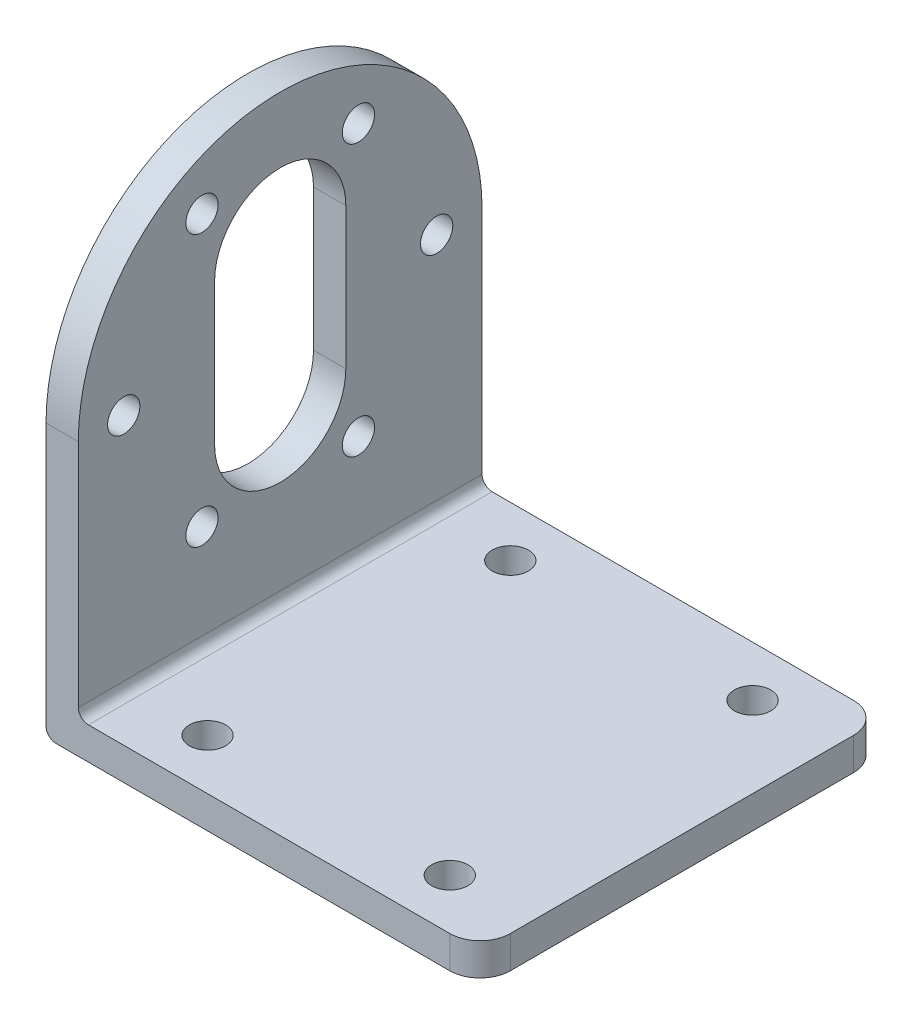
ISO-10303-21;
HEADER;
FILE_DESCRIPTION(('STEP AP214'),'2;1');
FILE_NAME('part.step','',(''),(''),'','','');
FILE_SCHEMA(('AUTOMOTIVE_DESIGN { 1 0 10303 214 1 1 1 1 }'));
ENDSEC;
DATA;
#1=APPLICATION_CONTEXT('core data for automotive mechanical design processes');
#2=APPLICATION_PROTOCOL_DEFINITION('international standard','automotive_design',2000,#1);
#3=PRODUCT_CONTEXT('',#1,'mechanical');
#4=PRODUCT('Part','Part','',(#3));
#5=PRODUCT_RELATED_PRODUCT_CATEGORY('part','',(#4));
#6=PRODUCT_DEFINITION_FORMATION('','',#4);
#7=PRODUCT_DEFINITION_CONTEXT('part definition',#1,'design');
#8=PRODUCT_DEFINITION('design','',#6,#7);
#9=PRODUCT_DEFINITION_SHAPE('','',#8);
#10=(LENGTH_UNIT() NAMED_UNIT(*) SI_UNIT(.MILLI.,.METRE.));
#11=(NAMED_UNIT(*) PLANE_ANGLE_UNIT() SI_UNIT($,.RADIAN.));
#12=(NAMED_UNIT(*) SI_UNIT($,.STERADIAN.) SOLID_ANGLE_UNIT());
#13=UNCERTAINTY_MEASURE_WITH_UNIT(LENGTH_MEASURE(1.E-05),#10,'distance_accuracy_value','');
#14=(GEOMETRIC_REPRESENTATION_CONTEXT(3) GLOBAL_UNCERTAINTY_ASSIGNED_CONTEXT((#13)) GLOBAL_UNIT_ASSIGNED_CONTEXT((#10,
#11,#12)) REPRESENTATION_CONTEXT('',''));
#15=CARTESIAN_POINT('',(0.,0.,0.));
#16=DIRECTION('',(0.,0.,1.));
#17=DIRECTION('',(1.,0.,0.));
#18=AXIS2_PLACEMENT_3D('',#15,#16,#17);
#19=CARTESIAN_POINT('',(0.,3.2,0.));
#20=DIRECTION('',(0.,-1.,0.));
#21=DIRECTION('',(0.,0.,-1.));
#22=AXIS2_PLACEMENT_3D('',#19,#20,#21);
#23=PLANE('',#22);
#24=CARTESIAN_POINT('',(-10.5,3.2,-15.));
#25=DIRECTION('',(0.,1.,0.));
#26=DIRECTION('',(0.,0.,1.));
#27=AXIS2_PLACEMENT_3D('',#24,#25,#26);
#28=CIRCLE('',#27,1.8);
#29=CARTESIAN_POINT('',(-10.5,3.2,-13.2));
#30=VERTEX_POINT('',#29);
#31=EDGE_CURVE('E186',#30,#30,#28,.T.);
#32=ORIENTED_EDGE('',*,*,#31,.F.);
#33=EDGE_LOOP('',(#32));
#34=FACE_BOUND('',#33,.T.);
#35=CARTESIAN_POINT('',(-10.5,3.2,15.));
#36=DIRECTION('',(0.,1.,0.));
#37=DIRECTION('',(0.,0.,1.));
#38=AXIS2_PLACEMENT_3D('',#35,#36,#37);
#39=CIRCLE('',#38,1.8);
#40=CARTESIAN_POINT('',(-10.5,3.2,16.8));
#41=VERTEX_POINT('',#40);
#42=EDGE_CURVE('E192',#41,#41,#39,.T.);
#43=ORIENTED_EDGE('',*,*,#42,.F.);
#44=EDGE_LOOP('',(#43));
#45=FACE_BOUND('',#44,.T.);
#46=CARTESIAN_POINT('',(13.5,3.2,15.));
#47=DIRECTION('',(0.,1.,0.));
#48=DIRECTION('',(0.,0.,1.));
#49=AXIS2_PLACEMENT_3D('',#46,#47,#48);
#50=CIRCLE('',#49,1.8);
#51=CARTESIAN_POINT('',(13.5,3.2,16.8));
#52=VERTEX_POINT('',#51);
#53=EDGE_CURVE('E158',#52,#52,#50,.T.);
#54=ORIENTED_EDGE('',*,*,#53,.F.);
#55=EDGE_LOOP('',(#54));
#56=FACE_BOUND('',#55,.T.);
#57=CARTESIAN_POINT('',(13.5,3.2,-15.));
#58=DIRECTION('',(0.,1.,0.));
#59=DIRECTION('',(0.,0.,1.));
#60=AXIS2_PLACEMENT_3D('',#57,#58,#59);
#61=CIRCLE('',#60,1.8);
#62=CARTESIAN_POINT('',(13.5,3.2,-13.2));
#63=VERTEX_POINT('',#62);
#64=EDGE_CURVE('E185',#63,#63,#61,.T.);
#65=ORIENTED_EDGE('',*,*,#64,.F.);
#66=EDGE_LOOP('',(#65));
#67=FACE_BOUND('',#66,.T.);
#68=DIRECTION('',(-1.,0.,0.));
#69=VECTOR('',#68,1.);
#70=CARTESIAN_POINT('',(-21.5,3.2,-20.));
#71=LINE('',#70,#69);
#72=CARTESIAN_POINT('',(18.5,3.2,-20.));
#73=VERTEX_POINT('',#72);
#74=CARTESIAN_POINT('',(-17.3,3.2,-20.));
#75=VERTEX_POINT('',#74);
#76=EDGE_CURVE('E227',#73,#75,#71,.T.);
#77=ORIENTED_EDGE('',*,*,#76,.T.);
#78=DIRECTION('',(0.,0.,-1.));
#79=VECTOR('',#78,1.);
#80=CARTESIAN_POINT('',(-17.3,3.2,20.));
#81=LINE('',#80,#79);
#82=CARTESIAN_POINT('',(-17.3,3.2,20.));
#83=VERTEX_POINT('',#82);
#84=EDGE_CURVE('E266',#75,#83,#81,.F.);
#85=ORIENTED_EDGE('',*,*,#84,.T.);
#86=DIRECTION('',(1.,0.,0.));
#87=VECTOR('',#86,1.);
#88=CARTESIAN_POINT('',(-21.5,3.2,20.));
#89=LINE('',#88,#87);
#90=CARTESIAN_POINT('',(18.5,3.2,20.));
#91=VERTEX_POINT('',#90);
#92=EDGE_CURVE('E231',#83,#91,#89,.T.);
#93=ORIENTED_EDGE('',*,*,#92,.T.);
#94=CARTESIAN_POINT('',(18.5,3.2,17.));
#95=DIRECTION('',(0.,-1.,0.));
#96=DIRECTION('',(0.,0.,-1.));
#97=AXIS2_PLACEMENT_3D('',#94,#95,#96);
#98=CIRCLE('',#97,3.);
#99=CARTESIAN_POINT('',(21.5,3.2,17.));
#100=VERTEX_POINT('',#99);
#101=EDGE_CURVE('E258',#91,#100,#98,.F.);
#102=ORIENTED_EDGE('',*,*,#101,.T.);
#103=DIRECTION('',(0.,0.,-1.));
#104=VECTOR('',#103,1.);
#105=CARTESIAN_POINT('',(21.5,3.2,20.));
#106=LINE('',#105,#104);
#107=CARTESIAN_POINT('',(21.5,3.2,-17.));
#108=VERTEX_POINT('',#107);
#109=EDGE_CURVE('E224',#100,#108,#106,.T.);
#110=ORIENTED_EDGE('',*,*,#109,.T.);
#111=CARTESIAN_POINT('',(18.5,3.2,-17.));
#112=DIRECTION('',(0.,-1.,0.));
#113=DIRECTION('',(0.,0.,-1.));
#114=AXIS2_PLACEMENT_3D('',#111,#112,#113);
#115=CIRCLE('',#114,3.);
#116=EDGE_CURVE('E256',#108,#73,#115,.F.);
#117=ORIENTED_EDGE('',*,*,#116,.T.);
#118=EDGE_LOOP('',(#77,#85,#93,#102,#110,#117));
#119=FACE_BOUND('',#118,.T.);
#120=ADVANCED_FACE('F37',(#34,#45,#56,#67,#119),#23,.F.);
#121=CARTESIAN_POINT('',(21.5,3.2,20.));
#122=DIRECTION('',(-1.,0.,0.));
#123=DIRECTION('',(0.,0.,1.));
#124=AXIS2_PLACEMENT_3D('',#121,#122,#123);
#125=PLANE('',#124);
#126=ORIENTED_EDGE('',*,*,#109,.F.);
#127=DIRECTION('',(0.,-1.,0.));
#128=VECTOR('',#127,1.);
#129=CARTESIAN_POINT('',(21.5,3.2,17.));
#130=LINE('',#129,#128);
#131=CARTESIAN_POINT('',(21.5,0.,17.));
#132=VERTEX_POINT('',#131);
#133=EDGE_CURVE('E245',#100,#132,#130,.T.);
#134=ORIENTED_EDGE('',*,*,#133,.T.);
#135=DIRECTION('',(0.,0.,-1.));
#136=VECTOR('',#135,1.);
#137=CARTESIAN_POINT('',(21.5,0.,20.));
#138=LINE('',#137,#136);
#139=CARTESIAN_POINT('',(21.5,0.,-17.));
#140=VERTEX_POINT('',#139);
#141=EDGE_CURVE('E223',#132,#140,#138,.T.);
#142=ORIENTED_EDGE('',*,*,#141,.T.);
#143=DIRECTION('',(0.,-1.,0.));
#144=VECTOR('',#143,1.);
#145=CARTESIAN_POINT('',(21.5,3.2,-17.));
#146=LINE('',#145,#144);
#147=EDGE_CURVE('E243',#140,#108,#146,.F.);
#148=ORIENTED_EDGE('',*,*,#147,.T.);
#149=EDGE_LOOP('',(#126,#134,#142,#148));
#150=FACE_BOUND('',#149,.T.);
#151=ADVANCED_FACE('F304',(#150),#125,.F.);
#152=CARTESIAN_POINT('',(-21.5,3.2,-20.));
#153=DIRECTION('',(0.,0.,1.));
#154=DIRECTION('',(1.,0.,0.));
#155=AXIS2_PLACEMENT_3D('',#152,#153,#154);
#156=PLANE('',#155);
#157=DIRECTION('',(-1.,0.,0.));
#158=VECTOR('',#157,1.);
#159=CARTESIAN_POINT('',(-21.5,0.,-20.));
#160=LINE('',#159,#158);
#161=CARTESIAN_POINT('',(18.5,0.,-20.));
#162=VERTEX_POINT('',#161);
#163=CARTESIAN_POINT('',(-20.5,0.,-20.));
#164=VERTEX_POINT('',#163);
#165=EDGE_CURVE('E236',#162,#164,#160,.T.);
#166=ORIENTED_EDGE('',*,*,#165,.T.);
#167=CARTESIAN_POINT('',(-20.5,1.,-20.));
#168=DIRECTION('',(0.,0.,1.));
#169=DIRECTION('',(1.,0.,0.));
#170=AXIS2_PLACEMENT_3D('',#167,#168,#169);
#171=CIRCLE('',#170,1.);
#172=CARTESIAN_POINT('',(-21.5,1.,-20.));
#173=VERTEX_POINT('',#172);
#174=EDGE_CURVE('E273',#164,#173,#171,.F.);
#175=ORIENTED_EDGE('',*,*,#174,.T.);
#176=DIRECTION('',(0.,-1.,0.));
#177=VECTOR('',#176,1.);
#178=CARTESIAN_POINT('',(-21.5,3.2,-20.));
#179=LINE('',#178,#177);
#180=CARTESIAN_POINT('',(-21.5,27.,-20.));
#181=VERTEX_POINT('',#180);
#182=EDGE_CURVE('E240',#181,#173,#179,.T.);
#183=ORIENTED_EDGE('',*,*,#182,.F.);
#184=DIRECTION('',(-1.,0.,0.));
#185=VECTOR('',#184,1.);
#186=CARTESIAN_POINT('',(-21.5,27.,-20.));
#187=LINE('',#186,#185);
#188=CARTESIAN_POINT('',(-18.3,27.,-20.));
#189=VERTEX_POINT('',#188);
#190=EDGE_CURVE('E214',#189,#181,#187,.T.);
#191=ORIENTED_EDGE('',*,*,#190,.F.);
#192=DIRECTION('',(0.,-1.,0.));
#193=VECTOR('',#192,1.);
#194=CARTESIAN_POINT('',(-18.3,27.,-20.));
#195=LINE('',#194,#193);
#196=CARTESIAN_POINT('',(-18.3,4.2,-20.));
#197=VERTEX_POINT('',#196);
#198=EDGE_CURVE('E217',#189,#197,#195,.T.);
#199=ORIENTED_EDGE('',*,*,#198,.T.);
#200=CARTESIAN_POINT('',(-17.3,4.2,-20.));
#201=DIRECTION('',(0.,0.,1.));
#202=DIRECTION('',(1.,0.,0.));
#203=AXIS2_PLACEMENT_3D('',#200,#201,#202);
#204=CIRCLE('',#203,1.);
#205=EDGE_CURVE('E45',#197,#75,#204,.T.);
#206=ORIENTED_EDGE('',*,*,#205,.T.);
#207=ORIENTED_EDGE('',*,*,#76,.F.);
#208=DIRECTION('',(0.,-1.,0.));
#209=VECTOR('',#208,1.);
#210=CARTESIAN_POINT('',(18.5,3.2,-20.));
#211=LINE('',#210,#209);
#212=EDGE_CURVE('E260',#73,#162,#211,.T.);
#213=ORIENTED_EDGE('',*,*,#212,.T.);
#214=EDGE_LOOP('',(#166,#175,#183,#191,#199,#206,#207,#213));
#215=FACE_BOUND('',#214,.T.);
#216=ADVANCED_FACE('F276',(#215),#156,.F.);
#217=CARTESIAN_POINT('',(-21.5,3.2,20.));
#218=DIRECTION('',(1.,0.,0.));
#219=DIRECTION('',(0.,0.,-1.));
#220=AXIS2_PLACEMENT_3D('',#217,#218,#219);
#221=PLANE('',#220);
#222=CARTESIAN_POINT('',(-21.5,26.9999999999997,15.4999999999997));
#223=DIRECTION('',(1.,0.,0.));
#224=DIRECTION('',(0.,0.,-1.));
#225=AXIS2_PLACEMENT_3D('',#222,#223,#224);
#226=CIRCLE('',#225,1.6);
#227=CARTESIAN_POINT('',(-21.5,26.9999999999997,13.8999999999997));
#228=VERTEX_POINT('',#227);
#229=EDGE_CURVE('E566',#228,#228,#226,.F.);
#230=ORIENTED_EDGE('',*,*,#229,.F.);
#231=EDGE_LOOP('',(#230));
#232=FACE_BOUND('',#231,.T.);
#233=CARTESIAN_POINT('',(-21.5,13.5766062413411,7.74999999999928));
#234=DIRECTION('',(1.,0.,0.));
#235=DIRECTION('',(0.,0.,-1.));
#236=AXIS2_PLACEMENT_3D('',#233,#234,#235);
#237=CIRCLE('',#236,1.6);
#238=CARTESIAN_POINT('',(-21.5,13.5766062413411,6.14999999999927));
#239=VERTEX_POINT('',#238);
#240=EDGE_CURVE('E570',#239,#239,#237,.F.);
#241=ORIENTED_EDGE('',*,*,#240,.F.);
#242=EDGE_LOOP('',(#241));
#243=FACE_BOUND('',#242,.T.);
#244=CARTESIAN_POINT('',(-21.5,13.5766062413416,-7.75000000000076));
#245=DIRECTION('',(1.,0.,0.));
#246=DIRECTION('',(0.,0.,-1.));
#247=AXIS2_PLACEMENT_3D('',#244,#245,#246);
#248=CIRCLE('',#247,1.6);
#249=CARTESIAN_POINT('',(-21.5,13.5766062413416,-9.35000000000076));
#250=VERTEX_POINT('',#249);
#251=EDGE_CURVE('E591',#250,#250,#248,.F.);
#252=ORIENTED_EDGE('',*,*,#251,.F.);
#253=EDGE_LOOP('',(#252));
#254=FACE_BOUND('',#253,.T.);
#255=CARTESIAN_POINT('',(-21.5,27.0000000000006,-15.5000000000004));
#256=DIRECTION('',(1.,0.,0.));
#257=DIRECTION('',(0.,0.,-1.));
#258=AXIS2_PLACEMENT_3D('',#255,#256,#257);
#259=CIRCLE('',#258,1.6);
#260=CARTESIAN_POINT('',(-21.5,27.0000000000006,-17.1000000000004));
#261=VERTEX_POINT('',#260);
#262=EDGE_CURVE('E585',#261,#261,#259,.F.);
#263=ORIENTED_EDGE('',*,*,#262,.F.);
#264=EDGE_LOOP('',(#263));
#265=FACE_BOUND('',#264,.T.);
#266=CARTESIAN_POINT('',(-21.5,40.4233937586592,-7.75000000000001));
#267=DIRECTION('',(1.,0.,0.));
#268=DIRECTION('',(0.,0.,-1.));
#269=AXIS2_PLACEMENT_3D('',#266,#267,#268);
#270=CIRCLE('',#269,1.60000000000001);
#271=CARTESIAN_POINT('',(-21.5,40.4233937586592,-9.35000000000001));
#272=VERTEX_POINT('',#271);
#273=EDGE_CURVE('E579',#272,#272,#270,.F.);
#274=ORIENTED_EDGE('',*,*,#273,.F.);
#275=EDGE_LOOP('',(#274));
#276=FACE_BOUND('',#275,.T.);
#277=CARTESIAN_POINT('',(-21.5,40.4233937586588,7.75000000000002));
#278=DIRECTION('',(1.,0.,0.));
#279=DIRECTION('',(0.,0.,-1.));
#280=AXIS2_PLACEMENT_3D('',#277,#278,#279);
#281=CIRCLE('',#280,1.6);
#282=CARTESIAN_POINT('',(-21.5,40.4233937586588,6.15000000000003));
#283=VERTEX_POINT('',#282);
#284=EDGE_CURVE('E578',#283,#283,#281,.F.);
#285=ORIENTED_EDGE('',*,*,#284,.F.);
#286=EDGE_LOOP('',(#285));
#287=FACE_BOUND('',#286,.T.);
#288=DIRECTION('',(0.,-1.,0.));
#289=VECTOR('',#288,1.);
#290=CARTESIAN_POINT('',(-21.5,34.,-6.5));
#291=LINE('',#290,#289);
#292=CARTESIAN_POINT('',(-21.5,34.,-6.5));
#293=VERTEX_POINT('',#292);
#294=CARTESIAN_POINT('',(-21.5,20.,-6.5));
#295=VERTEX_POINT('',#294);
#296=EDGE_CURVE('E164',#293,#295,#291,.T.);
#297=ORIENTED_EDGE('',*,*,#296,.F.);
#298=CARTESIAN_POINT('',(-21.5,34.,0.));
#299=DIRECTION('',(1.,0.,0.));
#300=DIRECTION('',(0.,0.,-1.));
#301=AXIS2_PLACEMENT_3D('',#298,#299,#300);
#302=CIRCLE('',#301,6.5);
#303=CARTESIAN_POINT('',(-21.5,34.,6.5));
#304=VERTEX_POINT('',#303);
#305=EDGE_CURVE('E142',#304,#293,#302,.F.);
#306=ORIENTED_EDGE('',*,*,#305,.F.);
#307=DIRECTION('',(0.,1.,0.));
#308=VECTOR('',#307,1.);
#309=CARTESIAN_POINT('',(-21.5,34.,6.5));
#310=LINE('',#309,#308);
#311=CARTESIAN_POINT('',(-21.5,20.,6.5));
#312=VERTEX_POINT('',#311);
#313=EDGE_CURVE('E154',#312,#304,#310,.T.);
#314=ORIENTED_EDGE('',*,*,#313,.F.);
#315=CARTESIAN_POINT('',(-21.5,20.,0.));
#316=DIRECTION('',(1.,0.,0.));
#317=DIRECTION('',(0.,0.,-1.));
#318=AXIS2_PLACEMENT_3D('',#315,#316,#317);
#319=CIRCLE('',#318,6.5);
#320=EDGE_CURVE('E168',#295,#312,#319,.F.);
#321=ORIENTED_EDGE('',*,*,#320,.F.);
#322=EDGE_LOOP('',(#297,#306,#314,#321));
#323=FACE_BOUND('',#322,.T.);
#324=ORIENTED_EDGE('',*,*,#182,.T.);
#325=DIRECTION('',(0.,0.,1.));
#326=VECTOR('',#325,1.);
#327=CARTESIAN_POINT('',(-21.5,1.,20.));
#328=LINE('',#327,#326);
#329=CARTESIAN_POINT('',(-21.5,1.,20.));
#330=VERTEX_POINT('',#329);
#331=EDGE_CURVE('E268',#173,#330,#328,.T.);
#332=ORIENTED_EDGE('',*,*,#331,.T.);
#333=DIRECTION('',(0.,-1.,0.));
#334=VECTOR('',#333,1.);
#335=CARTESIAN_POINT('',(-21.5,3.2,20.));
#336=LINE('',#335,#334);
#337=CARTESIAN_POINT('',(-21.5,27.,20.));
#338=VERTEX_POINT('',#337);
#339=EDGE_CURVE('E233',#338,#330,#336,.T.);
#340=ORIENTED_EDGE('',*,*,#339,.F.);
#341=CARTESIAN_POINT('',(-21.5,27.,0.));
#342=DIRECTION('',(1.,0.,0.));
#343=DIRECTION('',(0.,0.,-1.));
#344=AXIS2_PLACEMENT_3D('',#341,#342,#343);
#345=CIRCLE('',#344,20.);
#346=EDGE_CURVE('E206',#338,#181,#345,.F.);
#347=ORIENTED_EDGE('',*,*,#346,.T.);
#348=EDGE_LOOP('',(#324,#332,#340,#347));
#349=FACE_BOUND('',#348,.T.);
#350=ADVANCED_FACE('F161',(#232,#243,#254,#265,#276,#287,#323,#349),#221,.F.);
#351=CARTESIAN_POINT('',(-21.5,3.2,20.));
#352=DIRECTION('',(0.,0.,-1.));
#353=DIRECTION('',(-1.,0.,0.));
#354=AXIS2_PLACEMENT_3D('',#351,#352,#353);
#355=PLANE('',#354);
#356=ORIENTED_EDGE('',*,*,#339,.T.);
#357=CARTESIAN_POINT('',(-20.5,1.,20.));
#358=DIRECTION('',(0.,0.,-1.));
#359=DIRECTION('',(-1.,0.,0.));
#360=AXIS2_PLACEMENT_3D('',#357,#358,#359);
#361=CIRCLE('',#360,1.);
#362=CARTESIAN_POINT('',(-20.5,0.,20.));
#363=VERTEX_POINT('',#362);
#364=EDGE_CURVE('E60',#330,#363,#361,.F.);
#365=ORIENTED_EDGE('',*,*,#364,.T.);
#366=DIRECTION('',(1.,0.,0.));
#367=VECTOR('',#366,1.);
#368=CARTESIAN_POINT('',(-21.5,0.,20.));
#369=LINE('',#368,#367);
#370=CARTESIAN_POINT('',(18.5,0.,20.));
#371=VERTEX_POINT('',#370);
#372=EDGE_CURVE('E228',#363,#371,#369,.T.);
#373=ORIENTED_EDGE('',*,*,#372,.T.);
#374=DIRECTION('',(0.,-1.,0.));
#375=VECTOR('',#374,1.);
#376=CARTESIAN_POINT('',(18.5,3.2,20.));
#377=LINE('',#376,#375);
#378=EDGE_CURVE('E253',#371,#91,#377,.F.);
#379=ORIENTED_EDGE('',*,*,#378,.T.);
#380=ORIENTED_EDGE('',*,*,#92,.F.);
#381=CARTESIAN_POINT('',(-17.3,4.2,20.));
#382=DIRECTION('',(0.,0.,-1.));
#383=DIRECTION('',(-1.,0.,0.));
#384=AXIS2_PLACEMENT_3D('',#381,#382,#383);
#385=CIRCLE('',#384,1.);
#386=CARTESIAN_POINT('',(-18.3,4.2,20.));
#387=VERTEX_POINT('',#386);
#388=EDGE_CURVE('E11',#83,#387,#385,.T.);
#389=ORIENTED_EDGE('',*,*,#388,.T.);
#390=DIRECTION('',(0.,-1.,0.));
#391=VECTOR('',#390,1.);
#392=CARTESIAN_POINT('',(-18.3,27.,20.));
#393=LINE('',#392,#391);
#394=CARTESIAN_POINT('',(-18.3,27.,20.));
#395=VERTEX_POINT('',#394);
#396=EDGE_CURVE('E220',#395,#387,#393,.T.);
#397=ORIENTED_EDGE('',*,*,#396,.F.);
#398=DIRECTION('',(1.,0.,0.));
#399=VECTOR('',#398,1.);
#400=CARTESIAN_POINT('',(-21.5,27.,20.));
#401=LINE('',#400,#399);
#402=EDGE_CURVE('E209',#338,#395,#401,.T.);
#403=ORIENTED_EDGE('',*,*,#402,.F.);
#404=EDGE_LOOP('',(#356,#365,#373,#379,#380,#389,#397,#403));
#405=FACE_BOUND('',#404,.T.);
#406=ADVANCED_FACE('F287',(#405),#355,.F.);
#407=CARTESIAN_POINT('',(0.,0.,0.));
#408=DIRECTION('',(0.,-1.,0.));
#409=DIRECTION('',(0.,0.,-1.));
#410=AXIS2_PLACEMENT_3D('',#407,#408,#409);
#411=PLANE('',#410);
#412=CARTESIAN_POINT('',(-10.5,0.,-15.));
#413=DIRECTION('',(0.,1.,0.));
#414=DIRECTION('',(0.,0.,1.));
#415=AXIS2_PLACEMENT_3D('',#412,#413,#414);
#416=CIRCLE('',#415,1.8);
#417=CARTESIAN_POINT('',(-10.5,0.,-13.2));
#418=VERTEX_POINT('',#417);
#419=EDGE_CURVE('E182',#418,#418,#416,.T.);
#420=ORIENTED_EDGE('',*,*,#419,.T.);
#421=EDGE_LOOP('',(#420));
#422=FACE_BOUND('',#421,.T.);
#423=CARTESIAN_POINT('',(-10.5,0.,15.));
#424=DIRECTION('',(0.,1.,0.));
#425=DIRECTION('',(0.,0.,1.));
#426=AXIS2_PLACEMENT_3D('',#423,#424,#425);
#427=CIRCLE('',#426,1.8);
#428=CARTESIAN_POINT('',(-10.5,0.,16.8));
#429=VERTEX_POINT('',#428);
#430=EDGE_CURVE('E189',#429,#429,#427,.T.);
#431=ORIENTED_EDGE('',*,*,#430,.T.);
#432=EDGE_LOOP('',(#431));
#433=FACE_BOUND('',#432,.T.);
#434=CARTESIAN_POINT('',(13.5,0.,15.));
#435=DIRECTION('',(0.,1.,0.));
#436=DIRECTION('',(0.,0.,1.));
#437=AXIS2_PLACEMENT_3D('',#434,#435,#436);
#438=CIRCLE('',#437,1.8);
#439=CARTESIAN_POINT('',(13.5,0.,16.8));
#440=VERTEX_POINT('',#439);
#441=EDGE_CURVE('E195',#440,#440,#438,.T.);
#442=ORIENTED_EDGE('',*,*,#441,.T.);
#443=EDGE_LOOP('',(#442));
#444=FACE_BOUND('',#443,.T.);
#445=CARTESIAN_POINT('',(13.5,0.,-15.));
#446=DIRECTION('',(0.,1.,0.));
#447=DIRECTION('',(0.,0.,1.));
#448=AXIS2_PLACEMENT_3D('',#445,#446,#447);
#449=CIRCLE('',#448,1.8);
#450=CARTESIAN_POINT('',(13.5,0.,-13.2));
#451=VERTEX_POINT('',#450);
#452=EDGE_CURVE('E200',#451,#451,#449,.T.);
#453=ORIENTED_EDGE('',*,*,#452,.T.);
#454=EDGE_LOOP('',(#453));
#455=FACE_BOUND('',#454,.T.);
#456=ORIENTED_EDGE('',*,*,#372,.F.);
#457=DIRECTION('',(0.,0.,1.));
#458=VECTOR('',#457,1.);
#459=CARTESIAN_POINT('',(-20.5,0.,-20.));
#460=LINE('',#459,#458);
#461=EDGE_CURVE('E52',#363,#164,#460,.F.);
#462=ORIENTED_EDGE('',*,*,#461,.T.);
#463=ORIENTED_EDGE('',*,*,#165,.F.);
#464=CARTESIAN_POINT('',(18.5,0.,-17.));
#465=DIRECTION('',(0.,-1.,0.));
#466=DIRECTION('',(0.,0.,-1.));
#467=AXIS2_PLACEMENT_3D('',#464,#465,#466);
#468=CIRCLE('',#467,3.);
#469=EDGE_CURVE('E248',#162,#140,#468,.T.);
#470=ORIENTED_EDGE('',*,*,#469,.T.);
#471=ORIENTED_EDGE('',*,*,#141,.F.);
#472=CARTESIAN_POINT('',(18.5,0.,17.));
#473=DIRECTION('',(0.,-1.,0.));
#474=DIRECTION('',(0.,0.,-1.));
#475=AXIS2_PLACEMENT_3D('',#472,#473,#474);
#476=CIRCLE('',#475,3.);
#477=EDGE_CURVE('E250',#132,#371,#476,.T.);
#478=ORIENTED_EDGE('',*,*,#477,.T.);
#479=EDGE_LOOP('',(#456,#462,#463,#470,#471,#478));
#480=FACE_BOUND('',#479,.T.);
#481=ADVANCED_FACE('F298',(#422,#433,#444,#455,#480),#411,.T.);
#482=CARTESIAN_POINT('',(-18.3,27.,20.));
#483=DIRECTION('',(-1.,0.,0.));
#484=DIRECTION('',(0.,0.,1.));
#485=AXIS2_PLACEMENT_3D('',#482,#483,#484);
#486=PLANE('',#485);
#487=CARTESIAN_POINT('',(-18.3,26.9999999999997,15.4999999999997));
#488=DIRECTION('',(1.,0.,0.));
#489=DIRECTION('',(0.,0.,-1.));
#490=AXIS2_PLACEMENT_3D('',#487,#488,#489);
#491=CIRCLE('',#490,1.6);
#492=CARTESIAN_POINT('',(-18.3,26.9999999999997,13.8999999999997));
#493=VERTEX_POINT('',#492);
#494=EDGE_CURVE('E563',#493,#493,#491,.T.);
#495=ORIENTED_EDGE('',*,*,#494,.F.);
#496=EDGE_LOOP('',(#495));
#497=FACE_BOUND('',#496,.T.);
#498=CARTESIAN_POINT('',(-18.3,13.5766062413411,7.74999999999928));
#499=DIRECTION('',(1.,0.,0.));
#500=DIRECTION('',(0.,0.,-1.));
#501=AXIS2_PLACEMENT_3D('',#498,#499,#500);
#502=CIRCLE('',#501,1.6);
#503=CARTESIAN_POINT('',(-18.3,13.5766062413411,6.14999999999927));
#504=VERTEX_POINT('',#503);
#505=EDGE_CURVE('E567',#504,#504,#502,.T.);
#506=ORIENTED_EDGE('',*,*,#505,.F.);
#507=EDGE_LOOP('',(#506));
#508=FACE_BOUND('',#507,.T.);
#509=CARTESIAN_POINT('',(-18.3,13.5766062413416,-7.75000000000076));
#510=DIRECTION('',(1.,0.,0.));
#511=DIRECTION('',(0.,0.,-1.));
#512=AXIS2_PLACEMENT_3D('',#509,#510,#511);
#513=CIRCLE('',#512,1.6);
#514=CARTESIAN_POINT('',(-18.3,13.5766062413416,-9.35000000000076));
#515=VERTEX_POINT('',#514);
#516=EDGE_CURVE('E607',#515,#515,#513,.T.);
#517=ORIENTED_EDGE('',*,*,#516,.F.);
#518=EDGE_LOOP('',(#517));
#519=FACE_BOUND('',#518,.T.);
#520=CARTESIAN_POINT('',(-18.3,27.0000000000006,-15.5000000000004));
#521=DIRECTION('',(1.,0.,0.));
#522=DIRECTION('',(0.,0.,-1.));
#523=AXIS2_PLACEMENT_3D('',#520,#521,#522);
#524=CIRCLE('',#523,1.6);
#525=CARTESIAN_POINT('',(-18.3,27.0000000000006,-17.1000000000004));
#526=VERTEX_POINT('',#525);
#527=EDGE_CURVE('E588',#526,#526,#524,.T.);
#528=ORIENTED_EDGE('',*,*,#527,.F.);
#529=EDGE_LOOP('',(#528));
#530=FACE_BOUND('',#529,.T.);
#531=CARTESIAN_POINT('',(-18.3,40.4233937586592,-7.75000000000001));
#532=DIRECTION('',(1.,0.,0.));
#533=DIRECTION('',(0.,0.,-1.));
#534=AXIS2_PLACEMENT_3D('',#531,#532,#533);
#535=CIRCLE('',#534,1.60000000000001);
#536=CARTESIAN_POINT('',(-18.3,40.4233937586592,-9.35000000000001));
#537=VERTEX_POINT('',#536);
#538=EDGE_CURVE('E582',#537,#537,#535,.T.);
#539=ORIENTED_EDGE('',*,*,#538,.F.);
#540=EDGE_LOOP('',(#539));
#541=FACE_BOUND('',#540,.T.);
#542=CARTESIAN_POINT('',(-18.3,40.4233937586588,7.75000000000002));
#543=DIRECTION('',(1.,0.,0.));
#544=DIRECTION('',(0.,0.,-1.));
#545=AXIS2_PLACEMENT_3D('',#542,#543,#544);
#546=CIRCLE('',#545,1.6);
#547=CARTESIAN_POINT('',(-18.3,40.4233937586588,6.15000000000003));
#548=VERTEX_POINT('',#547);
#549=EDGE_CURVE('E575',#548,#548,#546,.T.);
#550=ORIENTED_EDGE('',*,*,#549,.F.);
#551=EDGE_LOOP('',(#550));
#552=FACE_BOUND('',#551,.T.);
#553=DIRECTION('',(0.,-1.,0.));
#554=VECTOR('',#553,1.);
#555=CARTESIAN_POINT('',(-18.3,34.,6.5));
#556=LINE('',#555,#554);
#557=CARTESIAN_POINT('',(-18.3,34.,6.5));
#558=VERTEX_POINT('',#557);
#559=CARTESIAN_POINT('',(-18.3,20.,6.5));
#560=VERTEX_POINT('',#559);
#561=EDGE_CURVE('E166',#558,#560,#556,.T.);
#562=ORIENTED_EDGE('',*,*,#561,.F.);
#563=CARTESIAN_POINT('',(-18.3,34.,0.));
#564=DIRECTION('',(1.,0.,0.));
#565=DIRECTION('',(0.,0.,-1.));
#566=AXIS2_PLACEMENT_3D('',#563,#564,#565);
#567=CIRCLE('',#566,6.5);
#568=CARTESIAN_POINT('',(-18.3,34.,-6.5));
#569=VERTEX_POINT('',#568);
#570=EDGE_CURVE('E145',#569,#558,#567,.T.);
#571=ORIENTED_EDGE('',*,*,#570,.F.);
#572=DIRECTION('',(0.,1.,0.));
#573=VECTOR('',#572,1.);
#574=CARTESIAN_POINT('',(-18.3,34.,-6.5));
#575=LINE('',#574,#573);
#576=CARTESIAN_POINT('',(-18.3,20.,-6.5));
#577=VERTEX_POINT('',#576);
#578=EDGE_CURVE('E150',#577,#569,#575,.T.);
#579=ORIENTED_EDGE('',*,*,#578,.F.);
#580=CARTESIAN_POINT('',(-18.3,20.,0.));
#581=DIRECTION('',(1.,0.,0.));
#582=DIRECTION('',(0.,0.,-1.));
#583=AXIS2_PLACEMENT_3D('',#580,#581,#582);
#584=CIRCLE('',#583,6.5);
#585=EDGE_CURVE('E173',#560,#577,#584,.T.);
#586=ORIENTED_EDGE('',*,*,#585,.F.);
#587=EDGE_LOOP('',(#562,#571,#579,#586));
#588=FACE_BOUND('',#587,.T.);
#589=ORIENTED_EDGE('',*,*,#396,.T.);
#590=DIRECTION('',(0.,0.,-1.));
#591=VECTOR('',#590,1.);
#592=CARTESIAN_POINT('',(-18.3,4.2,-20.));
#593=LINE('',#592,#591);
#594=EDGE_CURVE('E263',#387,#197,#593,.T.);
#595=ORIENTED_EDGE('',*,*,#594,.T.);
#596=ORIENTED_EDGE('',*,*,#198,.F.);
#597=CARTESIAN_POINT('',(-18.3,27.,0.));
#598=DIRECTION('',(1.,0.,0.));
#599=DIRECTION('',(0.,0.,-1.));
#600=AXIS2_PLACEMENT_3D('',#597,#598,#599);
#601=CIRCLE('',#600,20.);
#602=EDGE_CURVE('E203',#189,#395,#601,.T.);
#603=ORIENTED_EDGE('',*,*,#602,.T.);
#604=EDGE_LOOP('',(#589,#595,#596,#603));
#605=FACE_BOUND('',#604,.T.);
#606=ADVANCED_FACE('F289',(#497,#508,#519,#530,#541,#552,#588,#605),#486,.F.);
#607=CARTESIAN_POINT('',(-66.2213595499958,27.,0.));
#608=DIRECTION('',(1.,0.,0.));
#609=DIRECTION('',(0.,0.,-1.));
#610=AXIS2_PLACEMENT_3D('',#607,#608,#609);
#611=CYLINDRICAL_SURFACE('',#610,20.);
#612=ORIENTED_EDGE('',*,*,#346,.F.);
#613=ORIENTED_EDGE('',*,*,#402,.T.);
#614=ORIENTED_EDGE('',*,*,#602,.F.);
#615=ORIENTED_EDGE('',*,*,#190,.T.);
#616=EDGE_LOOP('',(#612,#613,#614,#615));
#617=FACE_BOUND('',#616,.T.);
#618=ADVANCED_FACE('F293',(#617),#611,.T.);
#619=CARTESIAN_POINT('',(13.5,0.,-15.));
#620=DIRECTION('',(0.,1.,0.));
#621=DIRECTION('',(0.,0.,1.));
#622=AXIS2_PLACEMENT_3D('',#619,#620,#621);
#623=CYLINDRICAL_SURFACE('',#622,1.8);
#624=ORIENTED_EDGE('',*,*,#452,.F.);
#625=EDGE_LOOP('',(#624));
#626=FACE_BOUND('',#625,.T.);
#627=ORIENTED_EDGE('',*,*,#64,.T.);
#628=EDGE_LOOP('',(#627));
#629=FACE_BOUND('',#628,.T.);
#630=ADVANCED_FACE('F369',(#626,#629),#623,.F.);
#631=CARTESIAN_POINT('',(13.5,0.,15.));
#632=DIRECTION('',(0.,1.,0.));
#633=DIRECTION('',(0.,0.,1.));
#634=AXIS2_PLACEMENT_3D('',#631,#632,#633);
#635=CYLINDRICAL_SURFACE('',#634,1.8);
#636=ORIENTED_EDGE('',*,*,#441,.F.);
#637=EDGE_LOOP('',(#636));
#638=FACE_BOUND('',#637,.T.);
#639=ORIENTED_EDGE('',*,*,#53,.T.);
#640=EDGE_LOOP('',(#639));
#641=FACE_BOUND('',#640,.T.);
#642=ADVANCED_FACE('F375',(#638,#641),#635,.F.);
#643=CARTESIAN_POINT('',(-10.5,0.,15.));
#644=DIRECTION('',(0.,1.,0.));
#645=DIRECTION('',(0.,0.,1.));
#646=AXIS2_PLACEMENT_3D('',#643,#644,#645);
#647=CYLINDRICAL_SURFACE('',#646,1.8);
#648=ORIENTED_EDGE('',*,*,#430,.F.);
#649=EDGE_LOOP('',(#648));
#650=FACE_BOUND('',#649,.T.);
#651=ORIENTED_EDGE('',*,*,#42,.T.);
#652=EDGE_LOOP('',(#651));
#653=FACE_BOUND('',#652,.T.);
#654=ADVANCED_FACE('F383',(#650,#653),#647,.F.);
#655=CARTESIAN_POINT('',(-10.5,0.,-15.));
#656=DIRECTION('',(0.,1.,0.));
#657=DIRECTION('',(0.,0.,1.));
#658=AXIS2_PLACEMENT_3D('',#655,#656,#657);
#659=CYLINDRICAL_SURFACE('',#658,1.8);
#660=ORIENTED_EDGE('',*,*,#419,.F.);
#661=EDGE_LOOP('',(#660));
#662=FACE_BOUND('',#661,.T.);
#663=ORIENTED_EDGE('',*,*,#31,.T.);
#664=EDGE_LOOP('',(#663));
#665=FACE_BOUND('',#664,.T.);
#666=ADVANCED_FACE('F316',(#662,#665),#659,.F.);
#667=CARTESIAN_POINT('',(18.5,3.2,17.));
#668=DIRECTION('',(0.,-1.,0.));
#669=DIRECTION('',(0.,0.,-1.));
#670=AXIS2_PLACEMENT_3D('',#667,#668,#669);
#671=CYLINDRICAL_SURFACE('',#670,3.);
#672=ORIENTED_EDGE('',*,*,#101,.F.);
#673=ORIENTED_EDGE('',*,*,#378,.F.);
#674=ORIENTED_EDGE('',*,*,#477,.F.);
#675=ORIENTED_EDGE('',*,*,#133,.F.);
#676=EDGE_LOOP('',(#672,#673,#674,#675));
#677=FACE_BOUND('',#676,.T.);
#678=ADVANCED_FACE('F308',(#677),#671,.T.);
#679=CARTESIAN_POINT('',(18.5,3.2,-17.));
#680=DIRECTION('',(0.,-1.,0.));
#681=DIRECTION('',(0.,0.,-1.));
#682=AXIS2_PLACEMENT_3D('',#679,#680,#681);
#683=CYLINDRICAL_SURFACE('',#682,3.);
#684=ORIENTED_EDGE('',*,*,#116,.F.);
#685=ORIENTED_EDGE('',*,*,#147,.F.);
#686=ORIENTED_EDGE('',*,*,#469,.F.);
#687=ORIENTED_EDGE('',*,*,#212,.F.);
#688=EDGE_LOOP('',(#684,#685,#686,#687));
#689=FACE_BOUND('',#688,.T.);
#690=ADVANCED_FACE('F306',(#689),#683,.T.);
#691=CARTESIAN_POINT('',(-21.501,34.,0.));
#692=DIRECTION('',(1.,0.,0.));
#693=DIRECTION('',(0.,0.,-1.));
#694=AXIS2_PLACEMENT_3D('',#691,#692,#693);
#695=CYLINDRICAL_SURFACE('',#694,6.5);
#696=ORIENTED_EDGE('',*,*,#305,.T.);
#697=DIRECTION('',(1.,0.,0.));
#698=VECTOR('',#697,1.);
#699=CARTESIAN_POINT('',(-21.501,34.,-6.5));
#700=LINE('',#699,#698);
#701=EDGE_CURVE('E159',#293,#569,#700,.T.);
#702=ORIENTED_EDGE('',*,*,#701,.T.);
#703=ORIENTED_EDGE('',*,*,#570,.T.);
#704=DIRECTION('',(1.,0.,0.));
#705=VECTOR('',#704,1.);
#706=CARTESIAN_POINT('',(-21.501,34.,6.5));
#707=LINE('',#706,#705);
#708=EDGE_CURVE('E138',#304,#558,#707,.T.);
#709=ORIENTED_EDGE('',*,*,#708,.F.);
#710=EDGE_LOOP('',(#696,#702,#703,#709));
#711=FACE_BOUND('',#710,.T.);
#712=ADVANCED_FACE('F140',(#711),#695,.F.);
#713=CARTESIAN_POINT('',(-21.501,34.,-6.5));
#714=DIRECTION('',(0.,0.,-1.));
#715=DIRECTION('',(-1.,0.,0.));
#716=AXIS2_PLACEMENT_3D('',#713,#714,#715);
#717=PLANE('',#716);
#718=ORIENTED_EDGE('',*,*,#296,.T.);
#719=DIRECTION('',(1.,0.,0.));
#720=VECTOR('',#719,1.);
#721=CARTESIAN_POINT('',(-21.501,20.,-6.5));
#722=LINE('',#721,#720);
#723=EDGE_CURVE('E179',#295,#577,#722,.T.);
#724=ORIENTED_EDGE('',*,*,#723,.T.);
#725=ORIENTED_EDGE('',*,*,#578,.T.);
#726=ORIENTED_EDGE('',*,*,#701,.F.);
#727=EDGE_LOOP('',(#718,#724,#725,#726));
#728=FACE_BOUND('',#727,.T.);
#729=ADVANCED_FACE('F314',(#728),#717,.F.);
#730=CARTESIAN_POINT('',(-21.501,20.,0.));
#731=DIRECTION('',(1.,0.,0.));
#732=DIRECTION('',(0.,0.,-1.));
#733=AXIS2_PLACEMENT_3D('',#730,#731,#732);
#734=CYLINDRICAL_SURFACE('',#733,6.5);
#735=ORIENTED_EDGE('',*,*,#320,.T.);
#736=DIRECTION('',(1.,0.,0.));
#737=VECTOR('',#736,1.);
#738=CARTESIAN_POINT('',(-21.501,20.,6.5));
#739=LINE('',#738,#737);
#740=EDGE_CURVE('E149',#312,#560,#739,.T.);
#741=ORIENTED_EDGE('',*,*,#740,.T.);
#742=ORIENTED_EDGE('',*,*,#585,.T.);
#743=ORIENTED_EDGE('',*,*,#723,.F.);
#744=EDGE_LOOP('',(#735,#741,#742,#743));
#745=FACE_BOUND('',#744,.T.);
#746=ADVANCED_FACE('F424',(#745),#734,.F.);
#747=CARTESIAN_POINT('',(-21.501,34.,6.5));
#748=DIRECTION('',(0.,0.,1.));
#749=DIRECTION('',(1.,0.,0.));
#750=AXIS2_PLACEMENT_3D('',#747,#748,#749);
#751=PLANE('',#750);
#752=ORIENTED_EDGE('',*,*,#313,.T.);
#753=ORIENTED_EDGE('',*,*,#708,.T.);
#754=ORIENTED_EDGE('',*,*,#561,.T.);
#755=ORIENTED_EDGE('',*,*,#740,.F.);
#756=EDGE_LOOP('',(#752,#753,#754,#755));
#757=FACE_BOUND('',#756,.T.);
#758=ADVANCED_FACE('F155',(#757),#751,.F.);
#759=CARTESIAN_POINT('',(-21.501,40.4233937586588,7.75000000000002));
#760=DIRECTION('',(1.,0.,0.));
#761=DIRECTION('',(0.,0.,-1.));
#762=AXIS2_PLACEMENT_3D('',#759,#760,#761);
#763=CYLINDRICAL_SURFACE('',#762,1.6);
#764=ORIENTED_EDGE('',*,*,#549,.T.);
#765=EDGE_LOOP('',(#764));
#766=FACE_BOUND('',#765,.T.);
#767=ORIENTED_EDGE('',*,*,#284,.T.);
#768=EDGE_LOOP('',(#767));
#769=FACE_BOUND('',#768,.T.);
#770=ADVANCED_FACE('F443',(#766,#769),#763,.F.);
#771=CARTESIAN_POINT('',(-21.501,40.4233937586592,-7.75000000000001));
#772=DIRECTION('',(1.,0.,0.));
#773=DIRECTION('',(0.,0.,-1.));
#774=AXIS2_PLACEMENT_3D('',#771,#772,#773);
#775=CYLINDRICAL_SURFACE('',#774,1.60000000000001);
#776=ORIENTED_EDGE('',*,*,#538,.T.);
#777=EDGE_LOOP('',(#776));
#778=FACE_BOUND('',#777,.T.);
#779=ORIENTED_EDGE('',*,*,#273,.T.);
#780=EDGE_LOOP('',(#779));
#781=FACE_BOUND('',#780,.T.);
#782=ADVANCED_FACE('F452',(#778,#781),#775,.F.);
#783=CARTESIAN_POINT('',(-21.501,27.0000000000006,-15.5000000000004));
#784=DIRECTION('',(1.,0.,0.));
#785=DIRECTION('',(0.,0.,-1.));
#786=AXIS2_PLACEMENT_3D('',#783,#784,#785);
#787=CYLINDRICAL_SURFACE('',#786,1.6);
#788=ORIENTED_EDGE('',*,*,#527,.T.);
#789=EDGE_LOOP('',(#788));
#790=FACE_BOUND('',#789,.T.);
#791=ORIENTED_EDGE('',*,*,#262,.T.);
#792=EDGE_LOOP('',(#791));
#793=FACE_BOUND('',#792,.T.);
#794=ADVANCED_FACE('F462',(#790,#793),#787,.F.);
#795=CARTESIAN_POINT('',(-21.501,13.5766062413416,-7.75000000000076));
#796=DIRECTION('',(1.,0.,0.));
#797=DIRECTION('',(0.,0.,-1.));
#798=AXIS2_PLACEMENT_3D('',#795,#796,#797);
#799=CYLINDRICAL_SURFACE('',#798,1.6);
#800=ORIENTED_EDGE('',*,*,#516,.T.);
#801=EDGE_LOOP('',(#800));
#802=FACE_BOUND('',#801,.T.);
#803=ORIENTED_EDGE('',*,*,#251,.T.);
#804=EDGE_LOOP('',(#803));
#805=FACE_BOUND('',#804,.T.);
#806=ADVANCED_FACE('F472',(#802,#805),#799,.F.);
#807=CARTESIAN_POINT('',(-21.501,13.5766062413411,7.74999999999928));
#808=DIRECTION('',(1.,0.,0.));
#809=DIRECTION('',(0.,0.,-1.));
#810=AXIS2_PLACEMENT_3D('',#807,#808,#809);
#811=CYLINDRICAL_SURFACE('',#810,1.6);
#812=ORIENTED_EDGE('',*,*,#505,.T.);
#813=EDGE_LOOP('',(#812));
#814=FACE_BOUND('',#813,.T.);
#815=ORIENTED_EDGE('',*,*,#240,.T.);
#816=EDGE_LOOP('',(#815));
#817=FACE_BOUND('',#816,.T.);
#818=ADVANCED_FACE('F482',(#814,#817),#811,.F.);
#819=CARTESIAN_POINT('',(-21.501,26.9999999999997,15.4999999999997));
#820=DIRECTION('',(1.,0.,0.));
#821=DIRECTION('',(0.,0.,-1.));
#822=AXIS2_PLACEMENT_3D('',#819,#820,#821);
#823=CYLINDRICAL_SURFACE('',#822,1.6);
#824=ORIENTED_EDGE('',*,*,#494,.T.);
#825=EDGE_LOOP('',(#824));
#826=FACE_BOUND('',#825,.T.);
#827=ORIENTED_EDGE('',*,*,#229,.T.);
#828=EDGE_LOOP('',(#827));
#829=FACE_BOUND('',#828,.T.);
#830=ADVANCED_FACE('F492',(#826,#829),#823,.F.);
#831=CARTESIAN_POINT('',(-17.3,4.2,20.));
#832=DIRECTION('',(0.,0.,1.));
#833=DIRECTION('',(1.,0.,0.));
#834=AXIS2_PLACEMENT_3D('',#831,#832,#833);
#835=CYLINDRICAL_SURFACE('',#834,1.);
#836=ORIENTED_EDGE('',*,*,#388,.F.);
#837=ORIENTED_EDGE('',*,*,#84,.F.);
#838=ORIENTED_EDGE('',*,*,#205,.F.);
#839=ORIENTED_EDGE('',*,*,#594,.F.);
#840=EDGE_LOOP('',(#836,#837,#838,#839));
#841=FACE_BOUND('',#840,.T.);
#842=ADVANCED_FACE('F286',(#841),#835,.F.);
#843=CARTESIAN_POINT('',(-20.5,1.,20.));
#844=DIRECTION('',(0.,0.,-1.));
#845=DIRECTION('',(-1.,0.,0.));
#846=AXIS2_PLACEMENT_3D('',#843,#844,#845);
#847=CYLINDRICAL_SURFACE('',#846,1.);
#848=ORIENTED_EDGE('',*,*,#174,.F.);
#849=ORIENTED_EDGE('',*,*,#461,.F.);
#850=ORIENTED_EDGE('',*,*,#364,.F.);
#851=ORIENTED_EDGE('',*,*,#331,.F.);
#852=EDGE_LOOP('',(#848,#849,#850,#851));
#853=FACE_BOUND('',#852,.T.);
#854=ADVANCED_FACE('F39',(#853),#847,.T.);
#855=CLOSED_SHELL('',(#120,#151,#216,#350,#406,#481,#606,#618,#630,#642,#654,#666,#678,#690,
#712,#729,#746,#758,#770,#782,#794,#806,#818,#830,#842,#854));
#856=MANIFOLD_SOLID_BREP('B2',#855);
#857=ADVANCED_BREP_SHAPE_REPRESENTATION('',(#18,#856),#14);
#858=SHAPE_DEFINITION_REPRESENTATION(#9,#857);
ENDSEC;
END-ISO-10303-21;
